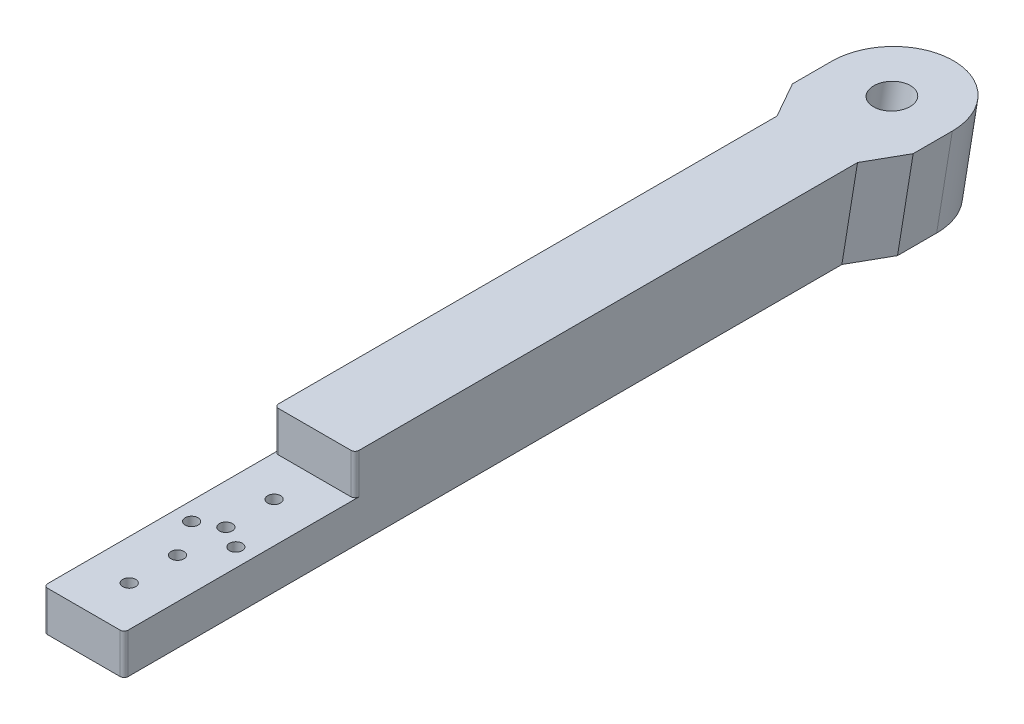
ISO-10303-21;
HEADER;
FILE_DESCRIPTION(('STEP AP214'),'2;1');
FILE_NAME('part.step','',(''),(''),'','','');
FILE_SCHEMA(('AUTOMOTIVE_DESIGN { 1 0 10303 214 1 1 1 1 }'));
ENDSEC;
DATA;
#1=APPLICATION_CONTEXT('core data for automotive mechanical design processes');
#2=APPLICATION_PROTOCOL_DEFINITION('international standard','automotive_design',2000,#1);
#3=PRODUCT_CONTEXT('',#1,'mechanical');
#4=PRODUCT('Part','Part','',(#3));
#5=PRODUCT_RELATED_PRODUCT_CATEGORY('part','',(#4));
#6=PRODUCT_DEFINITION_FORMATION('','',#4);
#7=PRODUCT_DEFINITION_CONTEXT('part definition',#1,'design');
#8=PRODUCT_DEFINITION('design','',#6,#7);
#9=PRODUCT_DEFINITION_SHAPE('','',#8);
#10=(LENGTH_UNIT() NAMED_UNIT(*) SI_UNIT(.MILLI.,.METRE.));
#11=(NAMED_UNIT(*) PLANE_ANGLE_UNIT() SI_UNIT($,.RADIAN.));
#12=(NAMED_UNIT(*) SI_UNIT($,.STERADIAN.) SOLID_ANGLE_UNIT());
#13=UNCERTAINTY_MEASURE_WITH_UNIT(LENGTH_MEASURE(1.E-05),#10,'distance_accuracy_value','');
#14=(GEOMETRIC_REPRESENTATION_CONTEXT(3) GLOBAL_UNCERTAINTY_ASSIGNED_CONTEXT((#13)) GLOBAL_UNIT_ASSIGNED_CONTEXT((#10,
#11,#12)) REPRESENTATION_CONTEXT('',''));
#15=CARTESIAN_POINT('',(0.,0.,0.));
#16=DIRECTION('',(0.,0.,1.));
#17=DIRECTION('',(1.,0.,0.));
#18=AXIS2_PLACEMENT_3D('',#15,#16,#17);
#19=CARTESIAN_POINT('',(-9.,10.,-58.35));
#20=DIRECTION('',(0.,1.,0.));
#21=DIRECTION('',(0.,0.,1.));
#22=AXIS2_PLACEMENT_3D('',#19,#20,#21);
#23=CYLINDRICAL_SURFACE('',#22,1.);
#24=CARTESIAN_POINT('',(-9.,10.,-58.35));
#25=DIRECTION('',(0.,1.,0.));
#26=DIRECTION('',(0.,0.,1.));
#27=AXIS2_PLACEMENT_3D('',#24,#25,#26);
#28=CIRCLE('',#27,1.);
#29=CARTESIAN_POINT('',(-10.,10.,-58.35));
#30=VERTEX_POINT('',#29);
#31=CARTESIAN_POINT('',(-9.,10.,-57.35));
#32=VERTEX_POINT('',#31);
#33=EDGE_CURVE('E307',#30,#32,#28,.T.);
#34=ORIENTED_EDGE('',*,*,#33,.F.);
#35=DIRECTION('',(0.,1.,0.));
#36=VECTOR('',#35,1.);
#37=CARTESIAN_POINT('',(-10.,10.,-58.35));
#38=LINE('',#37,#36);
#39=CARTESIAN_POINT('',(-10.,0.,-58.35));
#40=VERTEX_POINT('',#39);
#41=EDGE_CURVE('E251',#40,#30,#38,.T.);
#42=ORIENTED_EDGE('',*,*,#41,.F.);
#43=CARTESIAN_POINT('',(-9.,0.,-58.35));
#44=DIRECTION('',(0.,-1.,0.));
#45=DIRECTION('',(0.,0.,-1.));
#46=AXIS2_PLACEMENT_3D('',#43,#44,#45);
#47=CIRCLE('',#46,1.);
#48=CARTESIAN_POINT('',(-9.,0.,-57.35));
#49=VERTEX_POINT('',#48);
#50=EDGE_CURVE('E49',#49,#40,#47,.T.);
#51=ORIENTED_EDGE('',*,*,#50,.F.);
#52=DIRECTION('',(0.,-1.,0.));
#53=VECTOR('',#52,1.);
#54=CARTESIAN_POINT('',(-9.,0.,-57.35));
#55=LINE('',#54,#53);
#56=EDGE_CURVE('E233',#32,#49,#55,.T.);
#57=ORIENTED_EDGE('',*,*,#56,.F.);
#58=EDGE_LOOP('',(#34,#42,#51,#57));
#59=FACE_BOUND('',#58,.T.);
#60=ADVANCED_FACE('F17',(#59),#23,.T.);
#61=CARTESIAN_POINT('',(9.,-10.,-1.));
#62=DIRECTION('',(0.,1.,0.));
#63=DIRECTION('',(0.,0.,1.));
#64=AXIS2_PLACEMENT_3D('',#61,#62,#63);
#65=CYLINDRICAL_SURFACE('',#64,1.);
#66=CARTESIAN_POINT('',(9.,-10.,-1.));
#67=DIRECTION('',(0.,-1.,0.));
#68=DIRECTION('',(0.,0.,1.));
#69=AXIS2_PLACEMENT_3D('',#66,#67,#68);
#70=CIRCLE('',#69,1.);
#71=CARTESIAN_POINT('',(10.,-10.,-1.));
#72=VERTEX_POINT('',#71);
#73=CARTESIAN_POINT('',(9.,-10.,0.));
#74=VERTEX_POINT('',#73);
#75=EDGE_CURVE('E168',#72,#74,#70,.T.);
#76=ORIENTED_EDGE('',*,*,#75,.F.);
#77=DIRECTION('',(0.,-1.,0.));
#78=VECTOR('',#77,1.);
#79=CARTESIAN_POINT('',(10.,-10.,-1.));
#80=LINE('',#79,#78);
#81=CARTESIAN_POINT('',(10.,0.,-1.));
#82=VERTEX_POINT('',#81);
#83=EDGE_CURVE('E166',#82,#72,#80,.T.);
#84=ORIENTED_EDGE('',*,*,#83,.F.);
#85=CARTESIAN_POINT('',(9.,0.,-1.));
#86=DIRECTION('',(0.,1.,0.));
#87=DIRECTION('',(0.,0.,-1.));
#88=AXIS2_PLACEMENT_3D('',#85,#86,#87);
#89=CIRCLE('',#88,1.);
#90=CARTESIAN_POINT('',(9.,0.,0.));
#91=VERTEX_POINT('',#90);
#92=EDGE_CURVE('E151',#91,#82,#89,.T.);
#93=ORIENTED_EDGE('',*,*,#92,.F.);
#94=DIRECTION('',(0.,1.,0.));
#95=VECTOR('',#94,1.);
#96=CARTESIAN_POINT('',(9.,-10.,0.));
#97=LINE('',#96,#95);
#98=EDGE_CURVE('E214',#74,#91,#97,.T.);
#99=ORIENTED_EDGE('',*,*,#98,.F.);
#100=EDGE_LOOP('',(#76,#84,#93,#99));
#101=FACE_BOUND('',#100,.T.);
#102=ADVANCED_FACE('F167',(#101),#65,.T.);
#103=CARTESIAN_POINT('',(-9.,-10.,-1.));
#104=DIRECTION('',(0.,1.,0.));
#105=DIRECTION('',(0.,0.,1.));
#106=AXIS2_PLACEMENT_3D('',#103,#104,#105);
#107=CYLINDRICAL_SURFACE('',#106,1.);
#108=CARTESIAN_POINT('',(-9.,-10.,-1.));
#109=DIRECTION('',(0.,-1.,0.));
#110=DIRECTION('',(0.,0.,1.));
#111=AXIS2_PLACEMENT_3D('',#108,#109,#110);
#112=CIRCLE('',#111,1.);
#113=CARTESIAN_POINT('',(-9.,-10.,0.));
#114=VERTEX_POINT('',#113);
#115=CARTESIAN_POINT('',(-10.,-10.,-1.));
#116=VERTEX_POINT('',#115);
#117=EDGE_CURVE('E277',#114,#116,#112,.T.);
#118=ORIENTED_EDGE('',*,*,#117,.F.);
#119=DIRECTION('',(0.,-1.,0.));
#120=VECTOR('',#119,1.);
#121=CARTESIAN_POINT('',(-9.,-10.,0.));
#122=LINE('',#121,#120);
#123=CARTESIAN_POINT('',(-9.,0.,0.));
#124=VERTEX_POINT('',#123);
#125=EDGE_CURVE('E243',#124,#114,#122,.T.);
#126=ORIENTED_EDGE('',*,*,#125,.F.);
#127=CARTESIAN_POINT('',(-9.,0.,-1.));
#128=DIRECTION('',(0.,1.,0.));
#129=DIRECTION('',(0.,0.,-1.));
#130=AXIS2_PLACEMENT_3D('',#127,#128,#129);
#131=CIRCLE('',#130,1.);
#132=CARTESIAN_POINT('',(-10.,0.,-1.));
#133=VERTEX_POINT('',#132);
#134=EDGE_CURVE('E223',#133,#124,#131,.T.);
#135=ORIENTED_EDGE('',*,*,#134,.F.);
#136=DIRECTION('',(0.,1.,0.));
#137=VECTOR('',#136,1.);
#138=CARTESIAN_POINT('',(-10.,-10.,-1.));
#139=LINE('',#138,#137);
#140=EDGE_CURVE('E199',#116,#133,#139,.T.);
#141=ORIENTED_EDGE('',*,*,#140,.F.);
#142=EDGE_LOOP('',(#118,#126,#135,#141));
#143=FACE_BOUND('',#142,.T.);
#144=ADVANCED_FACE('F443',(#143),#107,.T.);
#145=CARTESIAN_POINT('',(9.,10.,-58.35));
#146=DIRECTION('',(0.,-1.,0.));
#147=DIRECTION('',(0.,0.,-1.));
#148=AXIS2_PLACEMENT_3D('',#145,#146,#147);
#149=CYLINDRICAL_SURFACE('',#148,1.);
#150=CARTESIAN_POINT('',(9.,0.,-58.35));
#151=DIRECTION('',(0.,-1.,0.));
#152=DIRECTION('',(0.,0.,-1.));
#153=AXIS2_PLACEMENT_3D('',#150,#151,#152);
#154=CIRCLE('',#153,1.);
#155=CARTESIAN_POINT('',(10.,0.,-58.35));
#156=VERTEX_POINT('',#155);
#157=CARTESIAN_POINT('',(9.,0.,-57.35));
#158=VERTEX_POINT('',#157);
#159=EDGE_CURVE('E39',#156,#158,#154,.T.);
#160=ORIENTED_EDGE('',*,*,#159,.F.);
#161=DIRECTION('',(0.,-1.,0.));
#162=VECTOR('',#161,1.);
#163=CARTESIAN_POINT('',(10.,0.,-58.35));
#164=LINE('',#163,#162);
#165=CARTESIAN_POINT('',(10.,10.,-58.35));
#166=VERTEX_POINT('',#165);
#167=EDGE_CURVE('E179',#166,#156,#164,.T.);
#168=ORIENTED_EDGE('',*,*,#167,.F.);
#169=CARTESIAN_POINT('',(9.,10.,-58.35));
#170=DIRECTION('',(0.,1.,0.));
#171=DIRECTION('',(0.,0.,1.));
#172=AXIS2_PLACEMENT_3D('',#169,#170,#171);
#173=CIRCLE('',#172,1.);
#174=CARTESIAN_POINT('',(9.,10.,-57.35));
#175=VERTEX_POINT('',#174);
#176=EDGE_CURVE('E235',#175,#166,#173,.T.);
#177=ORIENTED_EDGE('',*,*,#176,.F.);
#178=DIRECTION('',(0.,1.,0.));
#179=VECTOR('',#178,1.);
#180=CARTESIAN_POINT('',(9.,10.,-57.35));
#181=LINE('',#180,#179);
#182=EDGE_CURVE('E335',#158,#175,#181,.T.);
#183=ORIENTED_EDGE('',*,*,#182,.F.);
#184=EDGE_LOOP('',(#160,#168,#177,#183));
#185=FACE_BOUND('',#184,.T.);
#186=ADVANCED_FACE('F461',(#185),#149,.T.);
#187=CARTESIAN_POINT('',(0.,-96.1289274379641,-180.089875851826));
#188=DIRECTION('',(0.,0.981627183447664,-0.190808995376545));
#189=DIRECTION('',(0.,0.190808995376545,0.981627183447664));
#190=AXIS2_PLACEMENT_3D('',#187,#188,#189);
#191=CYLINDRICAL_SURFACE('',#190,4.5);
#192=CARTESIAN_POINT('',(0.,-10.,-196.831643392917));
#193=DIRECTION('',(0.,1.,0.));
#194=DIRECTION('',(0.,0.,-1.));
#195=AXIS2_PLACEMENT_3D('',#192,#193,#194);
#196=ELLIPSE('',#195,4.58422512729847,4.5);
#197=CARTESIAN_POINT('',(0.,-10.,-201.415868520215));
#198=VERTEX_POINT('',#197);
#199=EDGE_CURVE('E247',#198,#198,#196,.T.);
#200=ORIENTED_EDGE('',*,*,#199,.F.);
#201=EDGE_LOOP('',(#200));
#202=FACE_BOUND('',#201,.T.);
#203=CARTESIAN_POINT('',(0.,10.,-200.719249575672));
#204=DIRECTION('',(0.,1.,0.));
#205=DIRECTION('',(0.,0.,-1.));
#206=AXIS2_PLACEMENT_3D('',#203,#204,#205);
#207=ELLIPSE('',#206,4.58422512729847,4.5);
#208=CARTESIAN_POINT('',(0.,10.,-205.30347470297));
#209=VERTEX_POINT('',#208);
#210=EDGE_CURVE('E319',#209,#209,#207,.T.);
#211=ORIENTED_EDGE('',*,*,#210,.T.);
#212=EDGE_LOOP('',(#211));
#213=FACE_BOUND('',#212,.T.);
#214=ADVANCED_FACE('F463',(#202,#213),#191,.F.);
#215=CARTESIAN_POINT('',(10.,-43.3943138442208,-171.798851397859));
#216=DIRECTION('',(-0.866025403784437,-0.0954044976882732,-0.490813591723835));
#217=DIRECTION('',(-0.493062653792703,0.,0.869993804250868));
#218=AXIS2_PLACEMENT_3D('',#215,#216,#217);
#219=PLANE('',#218);
#220=DIRECTION('',(-0.493062653792702,0.,0.869993804250868));
#221=VECTOR('',#220,1.);
#222=CARTESIAN_POINT('',(-68.9106662043679,-10.,-39.0546183057083));
#223=LINE('',#222,#221);
#224=CARTESIAN_POINT('',(15.,-10.,-187.112393817246));
#225=VERTEX_POINT('',#224);
#226=CARTESIAN_POINT('',(10.,-10.,-178.29004844634));
#227=VERTEX_POINT('',#226);
#228=EDGE_CURVE('E209',#225,#227,#223,.T.);
#229=ORIENTED_EDGE('',*,*,#228,.F.);
#230=DIRECTION('',(0.,-0.981627183447664,0.190808995376545));
#231=VECTOR('',#230,1.);
#232=CARTESIAN_POINT('',(15.,10.,-191.));
#233=LINE('',#232,#231);
#234=CARTESIAN_POINT('',(15.,10.,-191.));
#235=VERTEX_POINT('',#234);
#236=EDGE_CURVE('E20',#235,#225,#233,.T.);
#237=ORIENTED_EDGE('',*,*,#236,.F.);
#238=DIRECTION('',(0.493062653792702,0.,-0.869993804250868));
#239=VECTOR('',#238,1.);
#240=CARTESIAN_POINT('',(5.54789347611286,10.,-174.322050352736));
#241=LINE('',#240,#239);
#242=CARTESIAN_POINT('',(10.,10.,-182.177654629095));
#243=VERTEX_POINT('',#242);
#244=EDGE_CURVE('E238',#243,#235,#241,.T.);
#245=ORIENTED_EDGE('',*,*,#244,.F.);
#246=DIRECTION('',(0.,0.981627183447664,-0.190808995376545));
#247=VECTOR('',#246,1.);
#248=CARTESIAN_POINT('',(10.,-43.3943138442208,-171.798851397859));
#249=LINE('',#248,#247);
#250=EDGE_CURVE('E213',#227,#243,#249,.T.);
#251=ORIENTED_EDGE('',*,*,#250,.F.);
#252=EDGE_LOOP('',(#229,#237,#245,#251));
#253=FACE_BOUND('',#252,.T.);
#254=ADVANCED_FACE('F423',(#253),#219,.F.);
#255=CARTESIAN_POINT('',(-10.,-7.61938417300112,-178.75279328673));
#256=DIRECTION('',(0.866025403784438,-0.095404497688273,-0.490813591723834));
#257=DIRECTION('',(0.,-0.981627183447664,0.190808995376545));
#258=AXIS2_PLACEMENT_3D('',#255,#256,#257);
#259=PLANE('',#258);
#260=DIRECTION('',(0.493062653792702,0.,0.869993804250868));
#261=VECTOR('',#260,1.);
#262=CARTESIAN_POINT('',(-8.5308664991491,10.,-179.585414001));
#263=LINE('',#262,#261);
#264=CARTESIAN_POINT('',(-15.,10.,-191.));
#265=VERTEX_POINT('',#264);
#266=CARTESIAN_POINT('',(-10.,10.,-182.177654629095));
#267=VERTEX_POINT('',#266);
#268=EDGE_CURVE('E230',#265,#267,#263,.T.);
#269=ORIENTED_EDGE('',*,*,#268,.F.);
#270=DIRECTION('',(0.,-0.981627183447664,0.190808995376545));
#271=VECTOR('',#270,1.);
#272=CARTESIAN_POINT('',(-15.,10.,-191.));
#273=LINE('',#272,#271);
#274=CARTESIAN_POINT('',(-15.,-10.,-187.112393817246));
#275=VERTEX_POINT('',#274);
#276=EDGE_CURVE('E11',#265,#275,#273,.T.);
#277=ORIENTED_EDGE('',*,*,#276,.T.);
#278=DIRECTION('',(-0.493062653792702,0.,-0.869993804250868));
#279=VECTOR('',#278,1.);
#280=CARTESIAN_POINT('',(68.9106662043678,-10.,-39.0546183057081));
#281=LINE('',#280,#279);
#282=CARTESIAN_POINT('',(-10.,-10.,-178.29004844634));
#283=VERTEX_POINT('',#282);
#284=EDGE_CURVE('E256',#283,#275,#281,.T.);
#285=ORIENTED_EDGE('',*,*,#284,.F.);
#286=DIRECTION('',(0.,-0.981627183447664,0.190808995376545));
#287=VECTOR('',#286,1.);
#288=CARTESIAN_POINT('',(-10.,-7.61938417300112,-178.75279328673));
#289=LINE('',#288,#287);
#290=EDGE_CURVE('E260',#267,#283,#289,.T.);
#291=ORIENTED_EDGE('',*,*,#290,.F.);
#292=EDGE_LOOP('',(#269,#277,#285,#291));
#293=FACE_BOUND('',#292,.T.);
#294=ADVANCED_FACE('F453',(#293),#259,.F.);
#295=CARTESIAN_POINT('',(0.,-37.2312964311041,-191.538415574419));
#296=DIRECTION('',(0.,-0.981627183447664,0.190808995376544));
#297=DIRECTION('',(0.,-0.190808995376544,-0.981627183447664));
#298=AXIS2_PLACEMENT_3D('',#295,#296,#297);
#299=CYLINDRICAL_SURFACE('',#298,15.);
#300=CARTESIAN_POINT('',(0.,-10.,-196.831643392917));
#301=DIRECTION('',(0.,-1.,0.));
#302=DIRECTION('',(0.,0.,1.));
#303=AXIS2_PLACEMENT_3D('',#300,#301,#302);
#304=ELLIPSE('',#303,15.2807504243282,15.);
#305=CARTESIAN_POINT('',(-15.,-10.,-196.831643392917));
#306=VERTEX_POINT('',#305);
#307=CARTESIAN_POINT('',(15.,-10.,-196.831643392917));
#308=VERTEX_POINT('',#307);
#309=EDGE_CURVE('E210',#306,#308,#304,.T.);
#310=ORIENTED_EDGE('',*,*,#309,.F.);
#311=DIRECTION('',(0.,-0.981627183447664,0.190808995376544));
#312=VECTOR('',#311,1.);
#313=CARTESIAN_POINT('',(-15.,-37.2312964311041,-191.538415574419));
#314=LINE('',#313,#312);
#315=CARTESIAN_POINT('',(-15.,10.,-200.719249575672));
#316=VERTEX_POINT('',#315);
#317=EDGE_CURVE('E26',#316,#306,#314,.T.);
#318=ORIENTED_EDGE('',*,*,#317,.F.);
#319=CARTESIAN_POINT('',(0.,10.,-200.719249575672));
#320=DIRECTION('',(0.,1.,0.));
#321=DIRECTION('',(0.,0.,1.));
#322=AXIS2_PLACEMENT_3D('',#319,#320,#321);
#323=ELLIPSE('',#322,15.2807504243282,15.);
#324=CARTESIAN_POINT('',(15.,10.,-200.719249575672));
#325=VERTEX_POINT('',#324);
#326=EDGE_CURVE('E339',#325,#316,#323,.T.);
#327=ORIENTED_EDGE('',*,*,#326,.F.);
#328=DIRECTION('',(0.,0.981627183447664,-0.190808995376544));
#329=VECTOR('',#328,1.);
#330=CARTESIAN_POINT('',(15.,12.8621349306482,-201.275592248285));
#331=LINE('',#330,#329);
#332=EDGE_CURVE('E408',#308,#325,#331,.T.);
#333=ORIENTED_EDGE('',*,*,#332,.F.);
#334=EDGE_LOOP('',(#310,#318,#327,#333));
#335=FACE_BOUND('',#334,.T.);
#336=ADVANCED_FACE('F430',(#335),#299,.T.);
#337=CARTESIAN_POINT('',(-15.,0.,0.));
#338=DIRECTION('',(1.,0.,0.));
#339=DIRECTION('',(0.,-1.,0.));
#340=AXIS2_PLACEMENT_3D('',#337,#338,#339);
#341=PLANE('',#340);
#342=DIRECTION('',(0.,0.,1.));
#343=VECTOR('',#342,1.);
#344=CARTESIAN_POINT('',(-15.,10.,-216.));
#345=LINE('',#344,#343);
#346=EDGE_CURVE('E234',#316,#265,#345,.T.);
#347=ORIENTED_EDGE('',*,*,#346,.F.);
#348=ORIENTED_EDGE('',*,*,#317,.T.);
#349=DIRECTION('',(0.,0.,-1.));
#350=VECTOR('',#349,1.);
#351=CARTESIAN_POINT('',(-15.,-10.,-187.112393817246));
#352=LINE('',#351,#350);
#353=EDGE_CURVE('E252',#275,#306,#352,.T.);
#354=ORIENTED_EDGE('',*,*,#353,.F.);
#355=ORIENTED_EDGE('',*,*,#276,.F.);
#356=EDGE_LOOP('',(#347,#348,#354,#355));
#357=FACE_BOUND('',#356,.T.);
#358=ADVANCED_FACE('F455',(#357),#341,.F.);
#359=CARTESIAN_POINT('',(15.,0.,0.));
#360=DIRECTION('',(1.,0.,0.));
#361=DIRECTION('',(0.,-1.,0.));
#362=AXIS2_PLACEMENT_3D('',#359,#360,#361);
#363=PLANE('',#362);
#364=DIRECTION('',(0.,0.,-1.));
#365=VECTOR('',#364,1.);
#366=CARTESIAN_POINT('',(15.,-10.,-187.112393817246));
#367=LINE('',#366,#365);
#368=EDGE_CURVE('E205',#225,#308,#367,.T.);
#369=ORIENTED_EDGE('',*,*,#368,.T.);
#370=ORIENTED_EDGE('',*,*,#332,.T.);
#371=DIRECTION('',(0.,0.,1.));
#372=VECTOR('',#371,1.);
#373=CARTESIAN_POINT('',(15.,10.,-216.));
#374=LINE('',#373,#372);
#375=EDGE_CURVE('E331',#325,#235,#374,.T.);
#376=ORIENTED_EDGE('',*,*,#375,.T.);
#377=ORIENTED_EDGE('',*,*,#236,.T.);
#378=EDGE_LOOP('',(#369,#370,#376,#377));
#379=FACE_BOUND('',#378,.T.);
#380=ADVANCED_FACE('F418',(#379),#363,.T.);
#381=CARTESIAN_POINT('',(5.5,110.,-32.26));
#382=DIRECTION('',(0.,-1.,0.));
#383=DIRECTION('',(0.,0.,-1.));
#384=AXIS2_PLACEMENT_3D('',#381,#382,#383);
#385=CYLINDRICAL_SURFACE('',#384,1.6);
#386=CARTESIAN_POINT('',(5.5,0.,-32.26));
#387=DIRECTION('',(0.,1.,0.));
#388=DIRECTION('',(0.,0.,-1.));
#389=AXIS2_PLACEMENT_3D('',#386,#387,#388);
#390=CIRCLE('',#389,1.6);
#391=CARTESIAN_POINT('',(5.5,0.,-33.86));
#392=VERTEX_POINT('',#391);
#393=EDGE_CURVE('E193',#392,#392,#390,.T.);
#394=ORIENTED_EDGE('',*,*,#393,.T.);
#395=EDGE_LOOP('',(#394));
#396=FACE_BOUND('',#395,.T.);
#397=CARTESIAN_POINT('',(5.5,-4.3,-32.26));
#398=DIRECTION('',(0.,-1.,0.));
#399=DIRECTION('',(0.,0.,1.));
#400=AXIS2_PLACEMENT_3D('',#397,#398,#399);
#401=CIRCLE('',#400,1.6);
#402=CARTESIAN_POINT('',(5.5,-4.3,-30.66));
#403=VERTEX_POINT('',#402);
#404=EDGE_CURVE('E364',#403,#403,#401,.T.);
#405=ORIENTED_EDGE('',*,*,#404,.T.);
#406=EDGE_LOOP('',(#405));
#407=FACE_BOUND('',#406,.T.);
#408=ADVANCED_FACE('F485',(#396,#407),#385,.F.);
#409=CARTESIAN_POINT('',(-5.5,110.,-32.26));
#410=DIRECTION('',(0.,-1.,0.));
#411=DIRECTION('',(0.,0.,-1.));
#412=AXIS2_PLACEMENT_3D('',#409,#410,#411);
#413=CYLINDRICAL_SURFACE('',#412,1.6);
#414=CARTESIAN_POINT('',(-5.5,0.,-32.26));
#415=DIRECTION('',(0.,1.,0.));
#416=DIRECTION('',(0.,0.,-1.));
#417=AXIS2_PLACEMENT_3D('',#414,#415,#416);
#418=CIRCLE('',#417,1.6);
#419=CARTESIAN_POINT('',(-5.5,0.,-33.86));
#420=VERTEX_POINT('',#419);
#421=EDGE_CURVE('E197',#420,#420,#418,.T.);
#422=ORIENTED_EDGE('',*,*,#421,.T.);
#423=EDGE_LOOP('',(#422));
#424=FACE_BOUND('',#423,.T.);
#425=CARTESIAN_POINT('',(-5.5,-4.3,-32.26));
#426=DIRECTION('',(0.,-1.,0.));
#427=DIRECTION('',(0.,0.,1.));
#428=AXIS2_PLACEMENT_3D('',#425,#426,#427);
#429=CIRCLE('',#428,1.6);
#430=CARTESIAN_POINT('',(-5.5,-4.3,-30.66));
#431=VERTEX_POINT('',#430);
#432=EDGE_CURVE('E369',#431,#431,#429,.T.);
#433=ORIENTED_EDGE('',*,*,#432,.T.);
#434=EDGE_LOOP('',(#433));
#435=FACE_BOUND('',#434,.T.);
#436=ADVANCED_FACE('F481',(#424,#435),#413,.F.);
#437=CARTESIAN_POINT('',(-5.5,-4.3,-32.26));
#438=DIRECTION('',(0.,-1.,0.));
#439=DIRECTION('',(0.,0.,-1.));
#440=AXIS2_PLACEMENT_3D('',#437,#438,#439);
#441=CYLINDRICAL_SURFACE('',#440,2.3);
#442=CARTESIAN_POINT('',(-5.5,-10.,-32.26));
#443=DIRECTION('',(0.,1.,0.));
#444=DIRECTION('',(0.,0.,1.));
#445=AXIS2_PLACEMENT_3D('',#442,#443,#444);
#446=CIRCLE('',#445,2.3);
#447=CARTESIAN_POINT('',(-5.5,-10.,-29.96));
#448=VERTEX_POINT('',#447);
#449=EDGE_CURVE('E315',#448,#448,#446,.T.);
#450=ORIENTED_EDGE('',*,*,#449,.F.);
#451=EDGE_LOOP('',(#450));
#452=FACE_BOUND('',#451,.T.);
#453=CARTESIAN_POINT('',(-5.5,-4.3,-32.26));
#454=DIRECTION('',(0.,1.,0.));
#455=DIRECTION('',(0.,0.,1.));
#456=AXIS2_PLACEMENT_3D('',#453,#454,#455);
#457=CIRCLE('',#456,2.3);
#458=CARTESIAN_POINT('',(-5.5,-4.3,-29.96));
#459=VERTEX_POINT('',#458);
#460=EDGE_CURVE('E373',#459,#459,#457,.T.);
#461=ORIENTED_EDGE('',*,*,#460,.T.);
#462=EDGE_LOOP('',(#461));
#463=FACE_BOUND('',#462,.T.);
#464=ADVANCED_FACE('F535',(#452,#463),#441,.F.);
#465=CARTESIAN_POINT('',(-5.5,-4.3,-32.26));
#466=DIRECTION('',(0.,1.,0.));
#467=DIRECTION('',(1.,0.,0.));
#468=AXIS2_PLACEMENT_3D('',#465,#466,#467);
#469=PLANE('',#468);
#470=ORIENTED_EDGE('',*,*,#460,.F.);
#471=EDGE_LOOP('',(#470));
#472=FACE_BOUND('',#471,.T.);
#473=ORIENTED_EDGE('',*,*,#432,.F.);
#474=EDGE_LOOP('',(#473));
#475=FACE_BOUND('',#474,.T.);
#476=ADVANCED_FACE('F543',(#472,#475),#469,.F.);
#477=CARTESIAN_POINT('',(5.5,-4.3,-32.26));
#478=DIRECTION('',(0.,-1.,0.));
#479=DIRECTION('',(0.,0.,-1.));
#480=AXIS2_PLACEMENT_3D('',#477,#478,#479);
#481=CYLINDRICAL_SURFACE('',#480,2.3);
#482=CARTESIAN_POINT('',(5.5,-10.,-32.26));
#483=DIRECTION('',(0.,1.,0.));
#484=DIRECTION('',(0.,0.,1.));
#485=AXIS2_PLACEMENT_3D('',#482,#483,#484);
#486=CIRCLE('',#485,2.3);
#487=CARTESIAN_POINT('',(5.5,-10.,-29.96));
#488=VERTEX_POINT('',#487);
#489=EDGE_CURVE('E311',#488,#488,#486,.T.);
#490=ORIENTED_EDGE('',*,*,#489,.F.);
#491=EDGE_LOOP('',(#490));
#492=FACE_BOUND('',#491,.T.);
#493=CARTESIAN_POINT('',(5.5,-4.3,-32.26));
#494=DIRECTION('',(0.,1.,0.));
#495=DIRECTION('',(0.,0.,1.));
#496=AXIS2_PLACEMENT_3D('',#493,#494,#495);
#497=CIRCLE('',#496,2.3);
#498=CARTESIAN_POINT('',(5.5,-4.3,-29.96));
#499=VERTEX_POINT('',#498);
#500=EDGE_CURVE('E374',#499,#499,#497,.T.);
#501=ORIENTED_EDGE('',*,*,#500,.T.);
#502=EDGE_LOOP('',(#501));
#503=FACE_BOUND('',#502,.T.);
#504=ADVANCED_FACE('F551',(#492,#503),#481,.F.);
#505=CARTESIAN_POINT('',(5.5,-4.3,-32.26));
#506=DIRECTION('',(0.,1.,0.));
#507=DIRECTION('',(1.,0.,0.));
#508=AXIS2_PLACEMENT_3D('',#505,#506,#507);
#509=PLANE('',#508);
#510=ORIENTED_EDGE('',*,*,#500,.F.);
#511=EDGE_LOOP('',(#510));
#512=FACE_BOUND('',#511,.T.);
#513=ORIENTED_EDGE('',*,*,#404,.F.);
#514=EDGE_LOOP('',(#513));
#515=FACE_BOUND('',#514,.T.);
#516=ADVANCED_FACE('F560',(#512,#515),#509,.F.);
#517=CARTESIAN_POINT('',(0.,-6.,-35.26));
#518=DIRECTION('',(0.,-1.,0.));
#519=DIRECTION('',(0.,0.,-1.));
#520=AXIS2_PLACEMENT_3D('',#517,#518,#519);
#521=CYLINDRICAL_SURFACE('',#520,3.);
#522=CARTESIAN_POINT('',(0.,-10.,-35.26));
#523=DIRECTION('',(0.,1.,0.));
#524=DIRECTION('',(0.,0.,1.));
#525=AXIS2_PLACEMENT_3D('',#522,#523,#524);
#526=CIRCLE('',#525,3.);
#527=CARTESIAN_POINT('',(0.,-10.,-32.26));
#528=VERTEX_POINT('',#527);
#529=EDGE_CURVE('E299',#528,#528,#526,.T.);
#530=ORIENTED_EDGE('',*,*,#529,.F.);
#531=EDGE_LOOP('',(#530));
#532=FACE_BOUND('',#531,.T.);
#533=CARTESIAN_POINT('',(0.,-6.,-35.26));
#534=DIRECTION('',(0.,1.,0.));
#535=DIRECTION('',(0.,0.,1.));
#536=AXIS2_PLACEMENT_3D('',#533,#534,#535);
#537=CIRCLE('',#536,3.);
#538=CARTESIAN_POINT('',(0.,-6.,-32.26));
#539=VERTEX_POINT('',#538);
#540=EDGE_CURVE('E360',#539,#539,#537,.T.);
#541=ORIENTED_EDGE('',*,*,#540,.T.);
#542=EDGE_LOOP('',(#541));
#543=FACE_BOUND('',#542,.T.);
#544=ADVANCED_FACE('F569',(#532,#543),#521,.F.);
#545=CARTESIAN_POINT('',(0.,-6.,-35.26));
#546=DIRECTION('',(0.,1.,0.));
#547=DIRECTION('',(1.,0.,0.));
#548=AXIS2_PLACEMENT_3D('',#545,#546,#547);
#549=PLANE('',#548);
#550=CARTESIAN_POINT('',(0.,-6.,-35.26));
#551=DIRECTION('',(0.,-1.,0.));
#552=DIRECTION('',(0.,0.,1.));
#553=AXIS2_PLACEMENT_3D('',#550,#551,#552);
#554=CIRCLE('',#553,1.6);
#555=CARTESIAN_POINT('',(0.,-6.,-33.66));
#556=VERTEX_POINT('',#555);
#557=EDGE_CURVE('E291',#556,#556,#554,.T.);
#558=ORIENTED_EDGE('',*,*,#557,.F.);
#559=EDGE_LOOP('',(#558));
#560=FACE_BOUND('',#559,.T.);
#561=ORIENTED_EDGE('',*,*,#540,.F.);
#562=EDGE_LOOP('',(#561));
#563=FACE_BOUND('',#562,.T.);
#564=ADVANCED_FACE('F578',(#560,#563),#549,.F.);
#565=CARTESIAN_POINT('',(0.,-6.,-47.26));
#566=DIRECTION('',(0.,-1.,0.));
#567=DIRECTION('',(0.,0.,-1.));
#568=AXIS2_PLACEMENT_3D('',#565,#566,#567);
#569=CYLINDRICAL_SURFACE('',#568,3.);
#570=CARTESIAN_POINT('',(0.,-10.,-47.26));
#571=DIRECTION('',(0.,1.,0.));
#572=DIRECTION('',(0.,0.,1.));
#573=AXIS2_PLACEMENT_3D('',#570,#571,#572);
#574=CIRCLE('',#573,3.);
#575=CARTESIAN_POINT('',(0.,-10.,-44.26));
#576=VERTEX_POINT('',#575);
#577=EDGE_CURVE('E303',#576,#576,#574,.T.);
#578=ORIENTED_EDGE('',*,*,#577,.F.);
#579=EDGE_LOOP('',(#578));
#580=FACE_BOUND('',#579,.T.);
#581=CARTESIAN_POINT('',(0.,-6.,-47.26));
#582=DIRECTION('',(0.,1.,0.));
#583=DIRECTION('',(0.,0.,1.));
#584=AXIS2_PLACEMENT_3D('',#581,#582,#583);
#585=CIRCLE('',#584,3.);
#586=CARTESIAN_POINT('',(0.,-6.,-44.26));
#587=VERTEX_POINT('',#586);
#588=EDGE_CURVE('E365',#587,#587,#585,.T.);
#589=ORIENTED_EDGE('',*,*,#588,.T.);
#590=EDGE_LOOP('',(#589));
#591=FACE_BOUND('',#590,.T.);
#592=ADVANCED_FACE('F587',(#580,#591),#569,.F.);
#593=CARTESIAN_POINT('',(0.,-6.,-47.26));
#594=DIRECTION('',(0.,1.,0.));
#595=DIRECTION('',(1.,0.,0.));
#596=AXIS2_PLACEMENT_3D('',#593,#594,#595);
#597=PLANE('',#596);
#598=CARTESIAN_POINT('',(0.,-6.,-47.26));
#599=DIRECTION('',(0.,-1.,0.));
#600=DIRECTION('',(0.,0.,1.));
#601=AXIS2_PLACEMENT_3D('',#598,#599,#600);
#602=CIRCLE('',#601,1.6);
#603=CARTESIAN_POINT('',(0.,-6.,-45.66));
#604=VERTEX_POINT('',#603);
#605=EDGE_CURVE('E348',#604,#604,#602,.T.);
#606=ORIENTED_EDGE('',*,*,#605,.F.);
#607=EDGE_LOOP('',(#606));
#608=FACE_BOUND('',#607,.T.);
#609=ORIENTED_EDGE('',*,*,#588,.F.);
#610=EDGE_LOOP('',(#609));
#611=FACE_BOUND('',#610,.T.);
#612=ADVANCED_FACE('F596',(#608,#611),#597,.F.);
#613=CARTESIAN_POINT('',(0.,-6.,-11.26));
#614=DIRECTION('',(0.,-1.,0.));
#615=DIRECTION('',(0.,0.,-1.));
#616=AXIS2_PLACEMENT_3D('',#613,#614,#615);
#617=CYLINDRICAL_SURFACE('',#616,3.);
#618=CARTESIAN_POINT('',(0.,-10.,-11.26));
#619=DIRECTION('',(0.,1.,0.));
#620=DIRECTION('',(0.,0.,1.));
#621=AXIS2_PLACEMENT_3D('',#618,#619,#620);
#622=CIRCLE('',#621,3.);
#623=CARTESIAN_POINT('',(0.,-10.,-8.26));
#624=VERTEX_POINT('',#623);
#625=EDGE_CURVE('E288',#624,#624,#622,.T.);
#626=ORIENTED_EDGE('',*,*,#625,.F.);
#627=EDGE_LOOP('',(#626));
#628=FACE_BOUND('',#627,.T.);
#629=CARTESIAN_POINT('',(0.,-6.,-11.26));
#630=DIRECTION('',(0.,1.,0.));
#631=DIRECTION('',(0.,0.,1.));
#632=AXIS2_PLACEMENT_3D('',#629,#630,#631);
#633=CIRCLE('',#632,3.);
#634=CARTESIAN_POINT('',(0.,-6.,-8.26));
#635=VERTEX_POINT('',#634);
#636=EDGE_CURVE('E393',#635,#635,#633,.T.);
#637=ORIENTED_EDGE('',*,*,#636,.T.);
#638=EDGE_LOOP('',(#637));
#639=FACE_BOUND('',#638,.T.);
#640=ADVANCED_FACE('F605',(#628,#639),#617,.F.);
#641=CARTESIAN_POINT('',(0.,-6.,-11.26));
#642=DIRECTION('',(0.,1.,0.));
#643=DIRECTION('',(1.,0.,0.));
#644=AXIS2_PLACEMENT_3D('',#641,#642,#643);
#645=PLANE('',#644);
#646=CARTESIAN_POINT('',(0.,-6.,-11.26));
#647=DIRECTION('',(0.,-1.,0.));
#648=DIRECTION('',(0.,0.,1.));
#649=AXIS2_PLACEMENT_3D('',#646,#647,#648);
#650=CIRCLE('',#649,1.6);
#651=CARTESIAN_POINT('',(0.,-6.,-9.66));
#652=VERTEX_POINT('',#651);
#653=EDGE_CURVE('E343',#652,#652,#650,.T.);
#654=ORIENTED_EDGE('',*,*,#653,.F.);
#655=EDGE_LOOP('',(#654));
#656=FACE_BOUND('',#655,.T.);
#657=ORIENTED_EDGE('',*,*,#636,.F.);
#658=EDGE_LOOP('',(#657));
#659=FACE_BOUND('',#658,.T.);
#660=ADVANCED_FACE('F614',(#656,#659),#645,.F.);
#661=CARTESIAN_POINT('',(0.,-6.,-23.26));
#662=DIRECTION('',(0.,-1.,0.));
#663=DIRECTION('',(0.,0.,-1.));
#664=AXIS2_PLACEMENT_3D('',#661,#662,#663);
#665=CYLINDRICAL_SURFACE('',#664,3.);
#666=CARTESIAN_POINT('',(0.,-10.,-23.26));
#667=DIRECTION('',(0.,1.,0.));
#668=DIRECTION('',(0.,0.,1.));
#669=AXIS2_PLACEMENT_3D('',#666,#667,#668);
#670=CIRCLE('',#669,3.);
#671=CARTESIAN_POINT('',(0.,-10.,-20.26));
#672=VERTEX_POINT('',#671);
#673=EDGE_CURVE('E295',#672,#672,#670,.T.);
#674=ORIENTED_EDGE('',*,*,#673,.F.);
#675=EDGE_LOOP('',(#674));
#676=FACE_BOUND('',#675,.T.);
#677=CARTESIAN_POINT('',(0.,-6.,-23.26));
#678=DIRECTION('',(0.,1.,0.));
#679=DIRECTION('',(0.,0.,1.));
#680=AXIS2_PLACEMENT_3D('',#677,#678,#679);
#681=CIRCLE('',#680,3.);
#682=CARTESIAN_POINT('',(0.,-6.,-20.26));
#683=VERTEX_POINT('',#682);
#684=EDGE_CURVE('E389',#683,#683,#681,.T.);
#685=ORIENTED_EDGE('',*,*,#684,.T.);
#686=EDGE_LOOP('',(#685));
#687=FACE_BOUND('',#686,.T.);
#688=ADVANCED_FACE('F623',(#676,#687),#665,.F.);
#689=CARTESIAN_POINT('',(0.,-6.,-23.26));
#690=DIRECTION('',(0.,1.,0.));
#691=DIRECTION('',(1.,0.,0.));
#692=AXIS2_PLACEMENT_3D('',#689,#690,#691);
#693=PLANE('',#692);
#694=CARTESIAN_POINT('',(0.,-6.,-23.26));
#695=DIRECTION('',(0.,-1.,0.));
#696=DIRECTION('',(0.,0.,1.));
#697=AXIS2_PLACEMENT_3D('',#694,#695,#696);
#698=CIRCLE('',#697,1.6);
#699=CARTESIAN_POINT('',(0.,-6.,-21.66));
#700=VERTEX_POINT('',#699);
#701=EDGE_CURVE('E347',#700,#700,#698,.T.);
#702=ORIENTED_EDGE('',*,*,#701,.F.);
#703=EDGE_LOOP('',(#702));
#704=FACE_BOUND('',#703,.T.);
#705=ORIENTED_EDGE('',*,*,#684,.F.);
#706=EDGE_LOOP('',(#705));
#707=FACE_BOUND('',#706,.T.);
#708=ADVANCED_FACE('F632',(#704,#707),#693,.F.);
#709=CARTESIAN_POINT('',(0.,165.,-23.26));
#710=DIRECTION('',(0.,-1.,0.));
#711=DIRECTION('',(0.,0.,-1.));
#712=AXIS2_PLACEMENT_3D('',#709,#710,#711);
#713=CYLINDRICAL_SURFACE('',#712,1.6);
#714=CARTESIAN_POINT('',(0.,0.,-23.26));
#715=DIRECTION('',(0.,-1.,0.));
#716=DIRECTION('',(0.,0.,-1.));
#717=AXIS2_PLACEMENT_3D('',#714,#715,#716);
#718=CIRCLE('',#717,1.6);
#719=CARTESIAN_POINT('',(0.,0.,-24.86));
#720=VERTEX_POINT('',#719);
#721=EDGE_CURVE('E196',#720,#720,#718,.T.);
#722=ORIENTED_EDGE('',*,*,#721,.F.);
#723=EDGE_LOOP('',(#722));
#724=FACE_BOUND('',#723,.T.);
#725=ORIENTED_EDGE('',*,*,#701,.T.);
#726=EDGE_LOOP('',(#725));
#727=FACE_BOUND('',#726,.T.);
#728=ADVANCED_FACE('F641',(#724,#727),#713,.F.);
#729=CARTESIAN_POINT('',(0.,165.,-11.26));
#730=DIRECTION('',(0.,-1.,0.));
#731=DIRECTION('',(0.,0.,-1.));
#732=AXIS2_PLACEMENT_3D('',#729,#730,#731);
#733=CYLINDRICAL_SURFACE('',#732,1.6);
#734=CARTESIAN_POINT('',(0.,0.,-11.26));
#735=DIRECTION('',(0.,-1.,0.));
#736=DIRECTION('',(0.,0.,-1.));
#737=AXIS2_PLACEMENT_3D('',#734,#735,#736);
#738=CIRCLE('',#737,1.6);
#739=CARTESIAN_POINT('',(0.,0.,-12.86));
#740=VERTEX_POINT('',#739);
#741=EDGE_CURVE('E192',#740,#740,#738,.T.);
#742=ORIENTED_EDGE('',*,*,#741,.F.);
#743=EDGE_LOOP('',(#742));
#744=FACE_BOUND('',#743,.T.);
#745=ORIENTED_EDGE('',*,*,#653,.T.);
#746=EDGE_LOOP('',(#745));
#747=FACE_BOUND('',#746,.T.);
#748=ADVANCED_FACE('F650',(#744,#747),#733,.F.);
#749=CARTESIAN_POINT('',(0.,165.,-47.26));
#750=DIRECTION('',(0.,-1.,0.));
#751=DIRECTION('',(0.,0.,-1.));
#752=AXIS2_PLACEMENT_3D('',#749,#750,#751);
#753=CYLINDRICAL_SURFACE('',#752,1.6);
#754=CARTESIAN_POINT('',(0.,0.,-47.26));
#755=DIRECTION('',(0.,-1.,0.));
#756=DIRECTION('',(0.,0.,-1.));
#757=AXIS2_PLACEMENT_3D('',#754,#755,#756);
#758=CIRCLE('',#757,1.6);
#759=CARTESIAN_POINT('',(0.,0.,-48.86));
#760=VERTEX_POINT('',#759);
#761=EDGE_CURVE('E188',#760,#760,#758,.T.);
#762=ORIENTED_EDGE('',*,*,#761,.F.);
#763=EDGE_LOOP('',(#762));
#764=FACE_BOUND('',#763,.T.);
#765=ORIENTED_EDGE('',*,*,#605,.T.);
#766=EDGE_LOOP('',(#765));
#767=FACE_BOUND('',#766,.T.);
#768=ADVANCED_FACE('F659',(#764,#767),#753,.F.);
#769=CARTESIAN_POINT('',(0.,165.,-35.26));
#770=DIRECTION('',(0.,-1.,0.));
#771=DIRECTION('',(0.,0.,-1.));
#772=AXIS2_PLACEMENT_3D('',#769,#770,#771);
#773=CYLINDRICAL_SURFACE('',#772,1.6);
#774=CARTESIAN_POINT('',(0.,0.,-35.26));
#775=DIRECTION('',(0.,-1.,0.));
#776=DIRECTION('',(0.,0.,-1.));
#777=AXIS2_PLACEMENT_3D('',#774,#775,#776);
#778=CIRCLE('',#777,1.6);
#779=CARTESIAN_POINT('',(0.,0.,-36.86));
#780=VERTEX_POINT('',#779);
#781=EDGE_CURVE('E163',#780,#780,#778,.T.);
#782=ORIENTED_EDGE('',*,*,#781,.F.);
#783=EDGE_LOOP('',(#782));
#784=FACE_BOUND('',#783,.T.);
#785=ORIENTED_EDGE('',*,*,#557,.T.);
#786=EDGE_LOOP('',(#785));
#787=FACE_BOUND('',#786,.T.);
#788=ADVANCED_FACE('F668',(#784,#787),#773,.F.);
#789=CARTESIAN_POINT('',(305.,0.,-57.35));
#790=DIRECTION('',(0.,-1.,0.));
#791=DIRECTION('',(0.,0.,-1.));
#792=AXIS2_PLACEMENT_3D('',#789,#790,#791);
#793=PLANE('',#792);
#794=DIRECTION('',(-1.,0.,0.));
#795=VECTOR('',#794,1.);
#796=CARTESIAN_POINT('',(305.,0.,0.));
#797=LINE('',#796,#795);
#798=EDGE_CURVE('E158',#91,#124,#797,.T.);
#799=ORIENTED_EDGE('',*,*,#798,.F.);
#800=ORIENTED_EDGE('',*,*,#92,.T.);
#801=DIRECTION('',(0.,0.,-1.));
#802=VECTOR('',#801,1.);
#803=CARTESIAN_POINT('',(10.,0.,0.));
#804=LINE('',#803,#802);
#805=EDGE_CURVE('E156',#82,#156,#804,.T.);
#806=ORIENTED_EDGE('',*,*,#805,.T.);
#807=ORIENTED_EDGE('',*,*,#159,.T.);
#808=DIRECTION('',(-1.,0.,0.));
#809=VECTOR('',#808,1.);
#810=CARTESIAN_POINT('',(305.,0.,-57.35));
#811=LINE('',#810,#809);
#812=EDGE_CURVE('E355',#158,#49,#811,.T.);
#813=ORIENTED_EDGE('',*,*,#812,.T.);
#814=ORIENTED_EDGE('',*,*,#50,.T.);
#815=DIRECTION('',(0.,0.,1.));
#816=VECTOR('',#815,1.);
#817=CARTESIAN_POINT('',(-10.,0.,-191.));
#818=LINE('',#817,#816);
#819=EDGE_CURVE('E242',#40,#133,#818,.T.);
#820=ORIENTED_EDGE('',*,*,#819,.T.);
#821=ORIENTED_EDGE('',*,*,#134,.T.);
#822=EDGE_LOOP('',(#799,#800,#806,#807,#813,#814,#820,#821));
#823=FACE_BOUND('',#822,.T.);
#824=ORIENTED_EDGE('',*,*,#781,.T.);
#825=EDGE_LOOP('',(#824));
#826=FACE_BOUND('',#825,.T.);
#827=ORIENTED_EDGE('',*,*,#761,.T.);
#828=EDGE_LOOP('',(#827));
#829=FACE_BOUND('',#828,.T.);
#830=ORIENTED_EDGE('',*,*,#741,.T.);
#831=EDGE_LOOP('',(#830));
#832=FACE_BOUND('',#831,.T.);
#833=ORIENTED_EDGE('',*,*,#721,.T.);
#834=EDGE_LOOP('',(#833));
#835=FACE_BOUND('',#834,.T.);
#836=ORIENTED_EDGE('',*,*,#393,.F.);
#837=EDGE_LOOP('',(#836));
#838=FACE_BOUND('',#837,.T.);
#839=ORIENTED_EDGE('',*,*,#421,.F.);
#840=EDGE_LOOP('',(#839));
#841=FACE_BOUND('',#840,.T.);
#842=ADVANCED_FACE('F153',(#823,#826,#829,#832,#835,#838,#841),#793,.F.);
#843=CARTESIAN_POINT('',(305.,10.,-57.35));
#844=DIRECTION('',(0.,0.,-1.));
#845=DIRECTION('',(0.,-1.,0.));
#846=AXIS2_PLACEMENT_3D('',#843,#844,#845);
#847=PLANE('',#846);
#848=DIRECTION('',(-1.,0.,0.));
#849=VECTOR('',#848,1.);
#850=CARTESIAN_POINT('',(305.,10.,-57.35));
#851=LINE('',#850,#849);
#852=EDGE_CURVE('E239',#175,#32,#851,.T.);
#853=ORIENTED_EDGE('',*,*,#852,.T.);
#854=ORIENTED_EDGE('',*,*,#56,.T.);
#855=ORIENTED_EDGE('',*,*,#812,.F.);
#856=ORIENTED_EDGE('',*,*,#182,.T.);
#857=EDGE_LOOP('',(#853,#854,#855,#856));
#858=FACE_BOUND('',#857,.T.);
#859=ADVANCED_FACE('F459',(#858),#847,.F.);
#860=CARTESIAN_POINT('',(0.,10.,0.));
#861=DIRECTION('',(0.,1.,0.));
#862=DIRECTION('',(1.,0.,0.));
#863=AXIS2_PLACEMENT_3D('',#860,#861,#862);
#864=PLANE('',#863);
#865=DIRECTION('',(0.,0.,1.));
#866=VECTOR('',#865,1.);
#867=CARTESIAN_POINT('',(-10.,10.,-191.));
#868=LINE('',#867,#866);
#869=EDGE_CURVE('E187',#267,#30,#868,.T.);
#870=ORIENTED_EDGE('',*,*,#869,.T.);
#871=ORIENTED_EDGE('',*,*,#33,.T.);
#872=ORIENTED_EDGE('',*,*,#852,.F.);
#873=ORIENTED_EDGE('',*,*,#176,.T.);
#874=DIRECTION('',(0.,0.,-1.));
#875=VECTOR('',#874,1.);
#876=CARTESIAN_POINT('',(10.,10.,0.));
#877=LINE('',#876,#875);
#878=EDGE_CURVE('E220',#166,#243,#877,.T.);
#879=ORIENTED_EDGE('',*,*,#878,.T.);
#880=ORIENTED_EDGE('',*,*,#244,.T.);
#881=ORIENTED_EDGE('',*,*,#375,.F.);
#882=ORIENTED_EDGE('',*,*,#326,.T.);
#883=ORIENTED_EDGE('',*,*,#346,.T.);
#884=ORIENTED_EDGE('',*,*,#268,.T.);
#885=EDGE_LOOP('',(#870,#871,#872,#873,#879,#880,#881,#882,#883,#884));
#886=FACE_BOUND('',#885,.T.);
#887=ORIENTED_EDGE('',*,*,#210,.F.);
#888=EDGE_LOOP('',(#887));
#889=FACE_BOUND('',#888,.T.);
#890=ADVANCED_FACE('F434',(#886,#889),#864,.T.);
#891=CARTESIAN_POINT('',(0.,-10.,0.));
#892=DIRECTION('',(0.,1.,0.));
#893=DIRECTION('',(1.,0.,0.));
#894=AXIS2_PLACEMENT_3D('',#891,#892,#893);
#895=PLANE('',#894);
#896=ORIENTED_EDGE('',*,*,#449,.T.);
#897=EDGE_LOOP('',(#896));
#898=FACE_BOUND('',#897,.T.);
#899=ORIENTED_EDGE('',*,*,#489,.T.);
#900=EDGE_LOOP('',(#899));
#901=FACE_BOUND('',#900,.T.);
#902=ORIENTED_EDGE('',*,*,#577,.T.);
#903=EDGE_LOOP('',(#902));
#904=FACE_BOUND('',#903,.T.);
#905=ORIENTED_EDGE('',*,*,#529,.T.);
#906=EDGE_LOOP('',(#905));
#907=FACE_BOUND('',#906,.T.);
#908=ORIENTED_EDGE('',*,*,#673,.T.);
#909=EDGE_LOOP('',(#908));
#910=FACE_BOUND('',#909,.T.);
#911=ORIENTED_EDGE('',*,*,#625,.T.);
#912=EDGE_LOOP('',(#911));
#913=FACE_BOUND('',#912,.T.);
#914=DIRECTION('',(0.,0.,-1.));
#915=VECTOR('',#914,1.);
#916=CARTESIAN_POINT('',(10.,-10.,0.));
#917=LINE('',#916,#915);
#918=EDGE_CURVE('E173',#72,#227,#917,.T.);
#919=ORIENTED_EDGE('',*,*,#918,.F.);
#920=ORIENTED_EDGE('',*,*,#75,.T.);
#921=DIRECTION('',(1.,0.,0.));
#922=VECTOR('',#921,1.);
#923=CARTESIAN_POINT('',(-10.,-10.,0.));
#924=LINE('',#923,#922);
#925=EDGE_CURVE('E203',#114,#74,#924,.T.);
#926=ORIENTED_EDGE('',*,*,#925,.F.);
#927=ORIENTED_EDGE('',*,*,#117,.T.);
#928=DIRECTION('',(0.,0.,1.));
#929=VECTOR('',#928,1.);
#930=CARTESIAN_POINT('',(-10.,-10.,-191.));
#931=LINE('',#930,#929);
#932=EDGE_CURVE('E204',#283,#116,#931,.T.);
#933=ORIENTED_EDGE('',*,*,#932,.F.);
#934=ORIENTED_EDGE('',*,*,#284,.T.);
#935=ORIENTED_EDGE('',*,*,#353,.T.);
#936=ORIENTED_EDGE('',*,*,#309,.T.);
#937=ORIENTED_EDGE('',*,*,#368,.F.);
#938=ORIENTED_EDGE('',*,*,#228,.T.);
#939=EDGE_LOOP('',(#919,#920,#926,#927,#933,#934,#935,#936,#937,#938));
#940=FACE_BOUND('',#939,.T.);
#941=ORIENTED_EDGE('',*,*,#199,.T.);
#942=EDGE_LOOP('',(#941));
#943=FACE_BOUND('',#942,.T.);
#944=ADVANCED_FACE('F425',(#898,#901,#904,#907,#910,#913,#940,#943),#895,.F.);
#945=CARTESIAN_POINT('',(-10.,-10.,0.));
#946=DIRECTION('',(0.,0.,1.));
#947=DIRECTION('',(1.,0.,0.));
#948=AXIS2_PLACEMENT_3D('',#945,#946,#947);
#949=PLANE('',#948);
#950=ORIENTED_EDGE('',*,*,#925,.T.);
#951=ORIENTED_EDGE('',*,*,#98,.T.);
#952=ORIENTED_EDGE('',*,*,#798,.T.);
#953=ORIENTED_EDGE('',*,*,#125,.T.);
#954=EDGE_LOOP('',(#950,#951,#952,#953));
#955=FACE_BOUND('',#954,.T.);
#956=ADVANCED_FACE('F440',(#955),#949,.T.);
#957=CARTESIAN_POINT('',(-10.,-10.,-191.));
#958=DIRECTION('',(-1.,0.,0.));
#959=DIRECTION('',(0.,1.,0.));
#960=AXIS2_PLACEMENT_3D('',#957,#958,#959);
#961=PLANE('',#960);
#962=ORIENTED_EDGE('',*,*,#819,.F.);
#963=ORIENTED_EDGE('',*,*,#41,.T.);
#964=ORIENTED_EDGE('',*,*,#869,.F.);
#965=ORIENTED_EDGE('',*,*,#290,.T.);
#966=ORIENTED_EDGE('',*,*,#932,.T.);
#967=ORIENTED_EDGE('',*,*,#140,.T.);
#968=EDGE_LOOP('',(#962,#963,#964,#965,#966,#967));
#969=FACE_BOUND('',#968,.T.);
#970=ADVANCED_FACE('F450',(#969),#961,.T.);
#971=CARTESIAN_POINT('',(10.,-10.,0.));
#972=DIRECTION('',(1.,0.,0.));
#973=DIRECTION('',(0.,0.,1.));
#974=AXIS2_PLACEMENT_3D('',#971,#972,#973);
#975=PLANE('',#974);
#976=ORIENTED_EDGE('',*,*,#805,.F.);
#977=ORIENTED_EDGE('',*,*,#83,.T.);
#978=ORIENTED_EDGE('',*,*,#918,.T.);
#979=ORIENTED_EDGE('',*,*,#250,.T.);
#980=ORIENTED_EDGE('',*,*,#878,.F.);
#981=ORIENTED_EDGE('',*,*,#167,.T.);
#982=EDGE_LOOP('',(#976,#977,#978,#979,#980,#981));
#983=FACE_BOUND('',#982,.T.);
#984=ADVANCED_FACE('F176',(#983),#975,.T.);
#985=CLOSED_SHELL('',(#60,#102,#144,#186,#214,#254,#294,#336,#358,#380,#408,#436,#464,#476,#504,
#516,#544,#564,#592,#612,#640,#660,#688,#708,#728,#748,#768,#788,#842,#859,#890,#944,#956,#970,#984));
#986=MANIFOLD_SOLID_BREP('B1',#985);
#987=ADVANCED_BREP_SHAPE_REPRESENTATION('',(#18,#986),#14);
#988=SHAPE_DEFINITION_REPRESENTATION(#9,#987);
ENDSEC;
END-ISO-10303-21;
